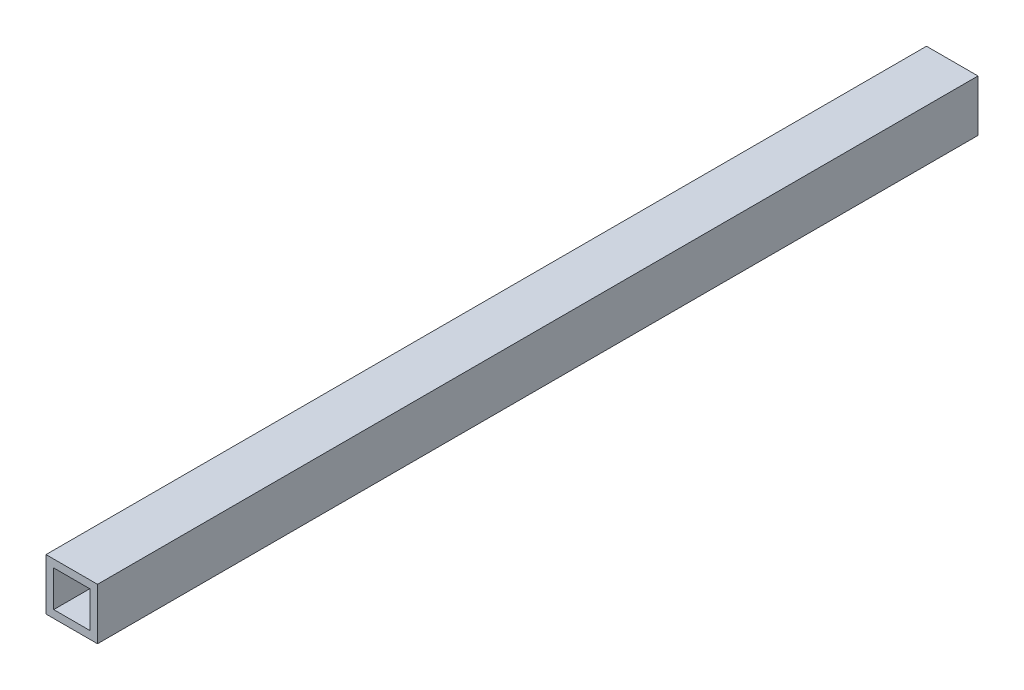
ISO-10303-21;
HEADER;
FILE_DESCRIPTION(('STEP AP214'),'2;1');
FILE_NAME('part.step','',(''),(''),'','','');
FILE_SCHEMA(('AUTOMOTIVE_DESIGN { 1 0 10303 214 1 1 1 1 }'));
ENDSEC;
DATA;
#1=APPLICATION_CONTEXT('core data for automotive mechanical design processes');
#2=APPLICATION_PROTOCOL_DEFINITION('international standard','automotive_design',2000,#1);
#3=PRODUCT_CONTEXT('',#1,'mechanical');
#4=PRODUCT('Part','Part','',(#3));
#5=PRODUCT_RELATED_PRODUCT_CATEGORY('part','',(#4));
#6=PRODUCT_DEFINITION_FORMATION('','',#4);
#7=PRODUCT_DEFINITION_CONTEXT('part definition',#1,'design');
#8=PRODUCT_DEFINITION('design','',#6,#7);
#9=PRODUCT_DEFINITION_SHAPE('','',#8);
#10=(LENGTH_UNIT() NAMED_UNIT(*) SI_UNIT(.MILLI.,.METRE.));
#11=(NAMED_UNIT(*) PLANE_ANGLE_UNIT() SI_UNIT($,.RADIAN.));
#12=(NAMED_UNIT(*) SI_UNIT($,.STERADIAN.) SOLID_ANGLE_UNIT());
#13=UNCERTAINTY_MEASURE_WITH_UNIT(LENGTH_MEASURE(1.E-05),#10,'distance_accuracy_value','');
#14=(GEOMETRIC_REPRESENTATION_CONTEXT(3) GLOBAL_UNCERTAINTY_ASSIGNED_CONTEXT((#13)) GLOBAL_UNIT_ASSIGNED_CONTEXT((#10,
#11,#12)) REPRESENTATION_CONTEXT('',''));
#15=CARTESIAN_POINT('',(0.,0.,0.));
#16=DIRECTION('',(0.,0.,1.));
#17=DIRECTION('',(1.,0.,0.));
#18=AXIS2_PLACEMENT_3D('',#15,#16,#17);
#19=CARTESIAN_POINT('',(0.,0.,200.));
#20=DIRECTION('',(0.,0.,-1.));
#21=DIRECTION('',(-1.,0.,0.));
#22=AXIS2_PLACEMENT_3D('',#19,#20,#21);
#23=PLANE('',#22);
#24=DIRECTION('',(0.,-1.,0.));
#25=VECTOR('',#24,1.);
#26=CARTESIAN_POINT('',(0.,0.,200.));
#27=LINE('',#26,#25);
#28=CARTESIAN_POINT('',(0.,11.7,200.));
#29=VERTEX_POINT('',#28);
#30=CARTESIAN_POINT('',(0.,0.,200.));
#31=VERTEX_POINT('',#30);
#32=EDGE_CURVE('E136',#29,#31,#27,.T.);
#33=ORIENTED_EDGE('',*,*,#32,.T.);
#34=DIRECTION('',(1.,0.,0.));
#35=VECTOR('',#34,1.);
#36=CARTESIAN_POINT('',(0.,0.,200.));
#37=LINE('',#36,#35);
#38=CARTESIAN_POINT('',(11.7,0.,200.));
#39=VERTEX_POINT('',#38);
#40=EDGE_CURVE('E139',#31,#39,#37,.T.);
#41=ORIENTED_EDGE('',*,*,#40,.T.);
#42=DIRECTION('',(0.,1.,0.));
#43=VECTOR('',#42,1.);
#44=CARTESIAN_POINT('',(11.7,0.,200.));
#45=LINE('',#44,#43);
#46=CARTESIAN_POINT('',(11.7,11.7,200.));
#47=VERTEX_POINT('',#46);
#48=EDGE_CURVE('E142',#39,#47,#45,.T.);
#49=ORIENTED_EDGE('',*,*,#48,.T.);
#50=DIRECTION('',(-1.,0.,0.));
#51=VECTOR('',#50,1.);
#52=CARTESIAN_POINT('',(0.,11.7,200.));
#53=LINE('',#52,#51);
#54=EDGE_CURVE('E144',#47,#29,#53,.T.);
#55=ORIENTED_EDGE('',*,*,#54,.T.);
#56=EDGE_LOOP('',(#33,#41,#49,#55));
#57=FACE_BOUND('',#56,.T.);
#58=DIRECTION('',(0.,-1.,0.));
#59=VECTOR('',#58,1.);
#60=CARTESIAN_POINT('',(1.75,1.75,200.));
#61=LINE('',#60,#59);
#62=CARTESIAN_POINT('',(1.75,9.95,200.));
#63=VERTEX_POINT('',#62);
#64=CARTESIAN_POINT('',(1.75,1.75,200.));
#65=VERTEX_POINT('',#64);
#66=EDGE_CURVE('E100',#63,#65,#61,.T.);
#67=ORIENTED_EDGE('',*,*,#66,.F.);
#68=DIRECTION('',(-1.,0.,0.));
#69=VECTOR('',#68,1.);
#70=CARTESIAN_POINT('',(1.75,9.95,200.));
#71=LINE('',#70,#69);
#72=CARTESIAN_POINT('',(9.95,9.95,200.));
#73=VERTEX_POINT('',#72);
#74=EDGE_CURVE('E122',#73,#63,#71,.T.);
#75=ORIENTED_EDGE('',*,*,#74,.F.);
#76=DIRECTION('',(0.,1.,0.));
#77=VECTOR('',#76,1.);
#78=CARTESIAN_POINT('',(9.95,1.75,200.));
#79=LINE('',#78,#77);
#80=CARTESIAN_POINT('',(9.95,1.75,200.));
#81=VERTEX_POINT('',#80);
#82=EDGE_CURVE('E120',#81,#73,#79,.T.);
#83=ORIENTED_EDGE('',*,*,#82,.F.);
#84=DIRECTION('',(1.,0.,0.));
#85=VECTOR('',#84,1.);
#86=CARTESIAN_POINT('',(1.75,1.75,200.));
#87=LINE('',#86,#85);
#88=EDGE_CURVE('E108',#65,#81,#87,.T.);
#89=ORIENTED_EDGE('',*,*,#88,.F.);
#90=EDGE_LOOP('',(#67,#75,#83,#89));
#91=FACE_BOUND('',#90,.T.);
#92=ADVANCED_FACE('F35',(#57,#91),#23,.F.);
#93=CARTESIAN_POINT('',(0.,0.,0.));
#94=DIRECTION('',(0.,0.,-1.));
#95=DIRECTION('',(-1.,0.,0.));
#96=AXIS2_PLACEMENT_3D('',#93,#94,#95);
#97=PLANE('',#96);
#98=DIRECTION('',(0.,-1.,0.));
#99=VECTOR('',#98,1.);
#100=CARTESIAN_POINT('',(0.,0.,0.));
#101=LINE('',#100,#99);
#102=CARTESIAN_POINT('',(0.,11.7,0.));
#103=VERTEX_POINT('',#102);
#104=CARTESIAN_POINT('',(0.,0.,0.));
#105=VERTEX_POINT('',#104);
#106=EDGE_CURVE('E116',#103,#105,#101,.T.);
#107=ORIENTED_EDGE('',*,*,#106,.F.);
#108=DIRECTION('',(-1.,0.,0.));
#109=VECTOR('',#108,1.);
#110=CARTESIAN_POINT('',(0.,11.7,0.));
#111=LINE('',#110,#109);
#112=CARTESIAN_POINT('',(11.7,11.7,0.));
#113=VERTEX_POINT('',#112);
#114=EDGE_CURVE('E140',#113,#103,#111,.T.);
#115=ORIENTED_EDGE('',*,*,#114,.F.);
#116=DIRECTION('',(0.,1.,0.));
#117=VECTOR('',#116,1.);
#118=CARTESIAN_POINT('',(11.7,0.,0.));
#119=LINE('',#118,#117);
#120=CARTESIAN_POINT('',(11.7,0.,0.));
#121=VERTEX_POINT('',#120);
#122=EDGE_CURVE('E151',#121,#113,#119,.T.);
#123=ORIENTED_EDGE('',*,*,#122,.F.);
#124=DIRECTION('',(1.,0.,0.));
#125=VECTOR('',#124,1.);
#126=CARTESIAN_POINT('',(0.,0.,0.));
#127=LINE('',#126,#125);
#128=EDGE_CURVE('E149',#105,#121,#127,.T.);
#129=ORIENTED_EDGE('',*,*,#128,.F.);
#130=EDGE_LOOP('',(#107,#115,#123,#129));
#131=FACE_BOUND('',#130,.T.);
#132=DIRECTION('',(-1.,0.,0.));
#133=VECTOR('',#132,1.);
#134=CARTESIAN_POINT('',(1.75,9.95,0.));
#135=LINE('',#134,#133);
#136=CARTESIAN_POINT('',(9.95,9.95,0.));
#137=VERTEX_POINT('',#136);
#138=CARTESIAN_POINT('',(1.75,9.95,0.));
#139=VERTEX_POINT('',#138);
#140=EDGE_CURVE('E109',#137,#139,#135,.T.);
#141=ORIENTED_EDGE('',*,*,#140,.T.);
#142=DIRECTION('',(0.,-1.,0.));
#143=VECTOR('',#142,1.);
#144=CARTESIAN_POINT('',(1.75,1.75,0.));
#145=LINE('',#144,#143);
#146=CARTESIAN_POINT('',(1.75,1.75,0.));
#147=VERTEX_POINT('',#146);
#148=EDGE_CURVE('E58',#139,#147,#145,.T.);
#149=ORIENTED_EDGE('',*,*,#148,.T.);
#150=DIRECTION('',(1.,0.,0.));
#151=VECTOR('',#150,1.);
#152=CARTESIAN_POINT('',(1.75,1.75,0.));
#153=LINE('',#152,#151);
#154=CARTESIAN_POINT('',(9.95,1.75,0.));
#155=VERTEX_POINT('',#154);
#156=EDGE_CURVE('E115',#147,#155,#153,.T.);
#157=ORIENTED_EDGE('',*,*,#156,.T.);
#158=DIRECTION('',(0.,1.,0.));
#159=VECTOR('',#158,1.);
#160=CARTESIAN_POINT('',(9.95,1.75,0.));
#161=LINE('',#160,#159);
#162=EDGE_CURVE('E128',#155,#137,#161,.T.);
#163=ORIENTED_EDGE('',*,*,#162,.T.);
#164=EDGE_LOOP('',(#141,#149,#157,#163));
#165=FACE_BOUND('',#164,.T.);
#166=ADVANCED_FACE('F169',(#131,#165),#97,.T.);
#167=CARTESIAN_POINT('',(0.,0.,200.));
#168=DIRECTION('',(1.,0.,0.));
#169=DIRECTION('',(0.,1.,0.));
#170=AXIS2_PLACEMENT_3D('',#167,#168,#169);
#171=PLANE('',#170);
#172=ORIENTED_EDGE('',*,*,#106,.T.);
#173=DIRECTION('',(0.,0.,-1.));
#174=VECTOR('',#173,1.);
#175=CARTESIAN_POINT('',(0.,0.,200.));
#176=LINE('',#175,#174);
#177=EDGE_CURVE('E11',#31,#105,#176,.T.);
#178=ORIENTED_EDGE('',*,*,#177,.F.);
#179=ORIENTED_EDGE('',*,*,#32,.F.);
#180=DIRECTION('',(0.,0.,-1.));
#181=VECTOR('',#180,1.);
#182=CARTESIAN_POINT('',(0.,11.7,200.));
#183=LINE('',#182,#181);
#184=EDGE_CURVE('E146',#29,#103,#183,.T.);
#185=ORIENTED_EDGE('',*,*,#184,.T.);
#186=EDGE_LOOP('',(#172,#178,#179,#185));
#187=FACE_BOUND('',#186,.T.);
#188=ADVANCED_FACE('F37',(#187),#171,.F.);
#189=CARTESIAN_POINT('',(0.,0.,200.));
#190=DIRECTION('',(0.,1.,0.));
#191=DIRECTION('',(0.,0.,1.));
#192=AXIS2_PLACEMENT_3D('',#189,#190,#191);
#193=PLANE('',#192);
#194=ORIENTED_EDGE('',*,*,#128,.T.);
#195=DIRECTION('',(0.,0.,-1.));
#196=VECTOR('',#195,1.);
#197=CARTESIAN_POINT('',(11.7,0.,200.));
#198=LINE('',#197,#196);
#199=EDGE_CURVE('E43',#39,#121,#198,.T.);
#200=ORIENTED_EDGE('',*,*,#199,.F.);
#201=ORIENTED_EDGE('',*,*,#40,.F.);
#202=ORIENTED_EDGE('',*,*,#177,.T.);
#203=EDGE_LOOP('',(#194,#200,#201,#202));
#204=FACE_BOUND('',#203,.T.);
#205=ADVANCED_FACE('F179',(#204),#193,.F.);
#206=CARTESIAN_POINT('',(11.7,0.,200.));
#207=DIRECTION('',(-1.,0.,0.));
#208=DIRECTION('',(0.,-1.,0.));
#209=AXIS2_PLACEMENT_3D('',#206,#207,#208);
#210=PLANE('',#209);
#211=ORIENTED_EDGE('',*,*,#122,.T.);
#212=DIRECTION('',(0.,0.,-1.));
#213=VECTOR('',#212,1.);
#214=CARTESIAN_POINT('',(11.7,11.7,200.));
#215=LINE('',#214,#213);
#216=EDGE_CURVE('E156',#47,#113,#215,.T.);
#217=ORIENTED_EDGE('',*,*,#216,.F.);
#218=ORIENTED_EDGE('',*,*,#48,.F.);
#219=ORIENTED_EDGE('',*,*,#199,.T.);
#220=EDGE_LOOP('',(#211,#217,#218,#219));
#221=FACE_BOUND('',#220,.T.);
#222=ADVANCED_FACE('F163',(#221),#210,.F.);
#223=CARTESIAN_POINT('',(0.,11.7,200.));
#224=DIRECTION('',(0.,-1.,0.));
#225=DIRECTION('',(0.,0.,-1.));
#226=AXIS2_PLACEMENT_3D('',#223,#224,#225);
#227=PLANE('',#226);
#228=ORIENTED_EDGE('',*,*,#114,.T.);
#229=ORIENTED_EDGE('',*,*,#184,.F.);
#230=ORIENTED_EDGE('',*,*,#54,.F.);
#231=ORIENTED_EDGE('',*,*,#216,.T.);
#232=EDGE_LOOP('',(#228,#229,#230,#231));
#233=FACE_BOUND('',#232,.T.);
#234=ADVANCED_FACE('F173',(#233),#227,.F.);
#235=CARTESIAN_POINT('',(1.75,1.75,200.));
#236=DIRECTION('',(1.,0.,0.));
#237=DIRECTION('',(0.,0.,-1.));
#238=AXIS2_PLACEMENT_3D('',#235,#236,#237);
#239=PLANE('',#238);
#240=ORIENTED_EDGE('',*,*,#148,.F.);
#241=DIRECTION('',(0.,0.,-1.));
#242=VECTOR('',#241,1.);
#243=CARTESIAN_POINT('',(1.75,9.95,200.));
#244=LINE('',#243,#242);
#245=EDGE_CURVE('E104',#63,#139,#244,.T.);
#246=ORIENTED_EDGE('',*,*,#245,.F.);
#247=ORIENTED_EDGE('',*,*,#66,.T.);
#248=DIRECTION('',(0.,0.,-1.));
#249=VECTOR('',#248,1.);
#250=CARTESIAN_POINT('',(1.75,1.75,200.));
#251=LINE('',#250,#249);
#252=EDGE_CURVE('E103',#65,#147,#251,.T.);
#253=ORIENTED_EDGE('',*,*,#252,.T.);
#254=EDGE_LOOP('',(#240,#246,#247,#253));
#255=FACE_BOUND('',#254,.T.);
#256=ADVANCED_FACE('F102',(#255),#239,.T.);
#257=CARTESIAN_POINT('',(1.75,1.75,200.));
#258=DIRECTION('',(0.,1.,0.));
#259=DIRECTION('',(0.,0.,1.));
#260=AXIS2_PLACEMENT_3D('',#257,#258,#259);
#261=PLANE('',#260);
#262=ORIENTED_EDGE('',*,*,#156,.F.);
#263=ORIENTED_EDGE('',*,*,#252,.F.);
#264=ORIENTED_EDGE('',*,*,#88,.T.);
#265=DIRECTION('',(0.,0.,-1.));
#266=VECTOR('',#265,1.);
#267=CARTESIAN_POINT('',(9.95,1.75,200.));
#268=LINE('',#267,#266);
#269=EDGE_CURVE('E117',#81,#155,#268,.T.);
#270=ORIENTED_EDGE('',*,*,#269,.T.);
#271=EDGE_LOOP('',(#262,#263,#264,#270));
#272=FACE_BOUND('',#271,.T.);
#273=ADVANCED_FACE('F112',(#272),#261,.T.);
#274=CARTESIAN_POINT('',(9.95,1.75,200.));
#275=DIRECTION('',(-1.,0.,0.));
#276=DIRECTION('',(0.,0.,1.));
#277=AXIS2_PLACEMENT_3D('',#274,#275,#276);
#278=PLANE('',#277);
#279=ORIENTED_EDGE('',*,*,#162,.F.);
#280=ORIENTED_EDGE('',*,*,#269,.F.);
#281=ORIENTED_EDGE('',*,*,#82,.T.);
#282=DIRECTION('',(0.,0.,-1.));
#283=VECTOR('',#282,1.);
#284=CARTESIAN_POINT('',(9.95,9.95,200.));
#285=LINE('',#284,#283);
#286=EDGE_CURVE('E50',#73,#137,#285,.T.);
#287=ORIENTED_EDGE('',*,*,#286,.T.);
#288=EDGE_LOOP('',(#279,#280,#281,#287));
#289=FACE_BOUND('',#288,.T.);
#290=ADVANCED_FACE('F202',(#289),#278,.T.);
#291=CARTESIAN_POINT('',(1.75,9.95,200.));
#292=DIRECTION('',(0.,-1.,0.));
#293=DIRECTION('',(0.,0.,-1.));
#294=AXIS2_PLACEMENT_3D('',#291,#292,#293);
#295=PLANE('',#294);
#296=ORIENTED_EDGE('',*,*,#140,.F.);
#297=ORIENTED_EDGE('',*,*,#286,.F.);
#298=ORIENTED_EDGE('',*,*,#74,.T.);
#299=ORIENTED_EDGE('',*,*,#245,.T.);
#300=EDGE_LOOP('',(#296,#297,#298,#299));
#301=FACE_BOUND('',#300,.T.);
#302=ADVANCED_FACE('F206',(#301),#295,.T.);
#303=CLOSED_SHELL('',(#92,#166,#188,#205,#222,#234,#256,#273,#290,#302));
#304=MANIFOLD_SOLID_BREP('B2',#303);
#305=ADVANCED_BREP_SHAPE_REPRESENTATION('',(#18,#304),#14);
#306=SHAPE_DEFINITION_REPRESENTATION(#9,#305);
ENDSEC;
END-ISO-10303-21;
